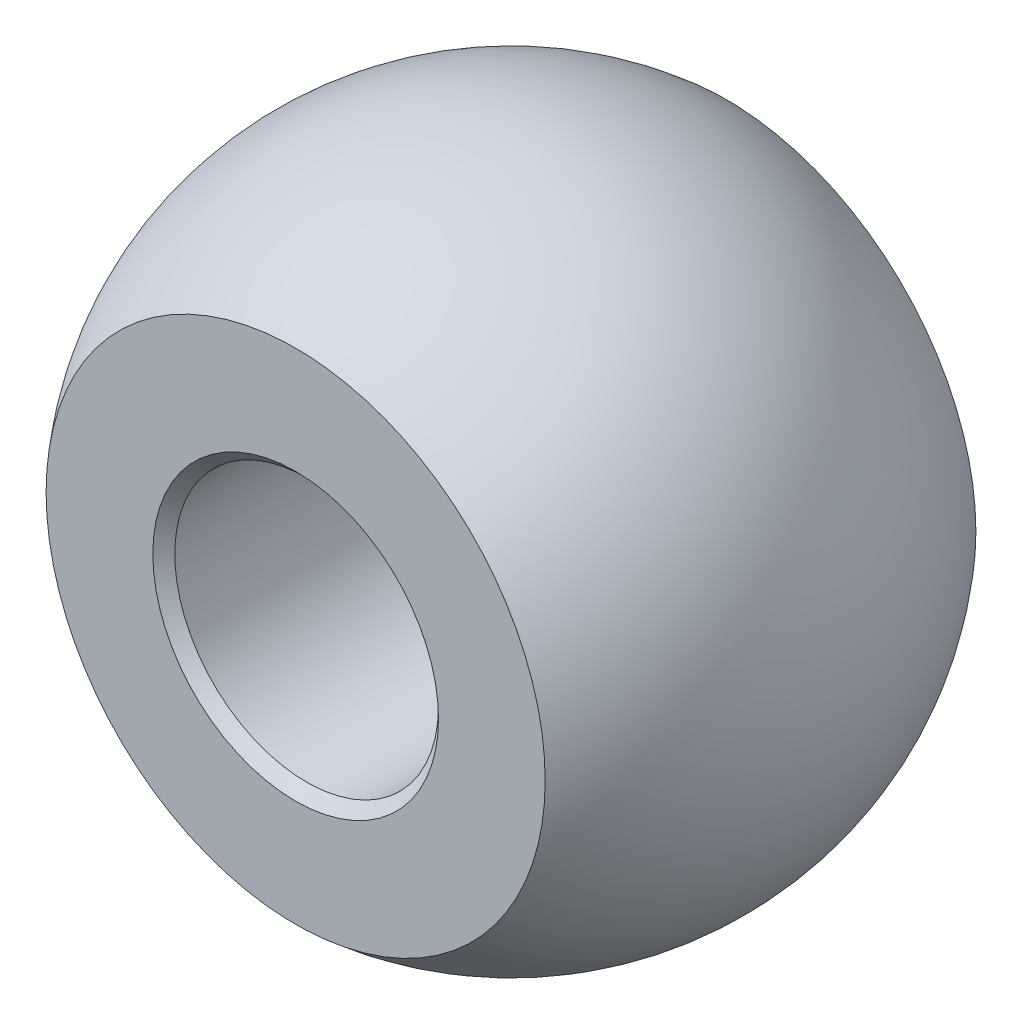
ISO-10303-21;
HEADER;
FILE_DESCRIPTION(('STEP AP214'),'2;1');
FILE_NAME('part.step','',(''),(''),'','','');
FILE_SCHEMA(('AUTOMOTIVE_DESIGN { 1 0 10303 214 1 1 1 1 }'));
ENDSEC;
DATA;
#1=APPLICATION_CONTEXT('core data for automotive mechanical design processes');
#2=APPLICATION_PROTOCOL_DEFINITION('international standard','automotive_design',2000,#1);
#3=PRODUCT_CONTEXT('',#1,'mechanical');
#4=PRODUCT('Part','Part','',(#3));
#5=PRODUCT_RELATED_PRODUCT_CATEGORY('part','',(#4));
#6=PRODUCT_DEFINITION_FORMATION('','',#4);
#7=PRODUCT_DEFINITION_CONTEXT('part definition',#1,'design');
#8=PRODUCT_DEFINITION('design','',#6,#7);
#9=PRODUCT_DEFINITION_SHAPE('','',#8);
#10=(LENGTH_UNIT() NAMED_UNIT(*) SI_UNIT(.MILLI.,.METRE.));
#11=(NAMED_UNIT(*) PLANE_ANGLE_UNIT() SI_UNIT($,.RADIAN.));
#12=(NAMED_UNIT(*) SI_UNIT($,.STERADIAN.) SOLID_ANGLE_UNIT());
#13=UNCERTAINTY_MEASURE_WITH_UNIT(LENGTH_MEASURE(1.E-05),#10,'distance_accuracy_value','');
#14=(GEOMETRIC_REPRESENTATION_CONTEXT(3) GLOBAL_UNCERTAINTY_ASSIGNED_CONTEXT((#13)) GLOBAL_UNIT_ASSIGNED_CONTEXT((#10,
#11,#12)) REPRESENTATION_CONTEXT('',''));
#15=CARTESIAN_POINT('',(0.,0.,0.));
#16=DIRECTION('',(0.,0.,1.));
#17=DIRECTION('',(1.,0.,0.));
#18=AXIS2_PLACEMENT_3D('',#15,#16,#17);
#19=CARTESIAN_POINT('',(0.,0.,0.));
#20=DIRECTION('',(0.,1.,0.));
#21=DIRECTION('',(1.,0.,0.));
#22=AXIS2_PLACEMENT_3D('',#19,#20,#21);
#23=SPHERICAL_SURFACE('',#22,3.75);
#24=CARTESIAN_POINT('',(0.,0.,0.));
#25=DIRECTION('',(0.,0.,-1.));
#26=DIRECTION('',(-1.,0.,0.));
#27=AXIS2_PLACEMENT_3D('',#24,#25,#26);
#28=SPHERICAL_SURFACE('',#27,3.75);
#29=CARTESIAN_POINT('',(0.,0.,2.45));
#30=DIRECTION('',(0.,0.,-1.));
#31=DIRECTION('',(-1.,0.,0.));
#32=AXIS2_PLACEMENT_3D('',#29,#30,#31);
#33=CIRCLE('',#32,2.83901391331568);
#34=CARTESIAN_POINT('',(-2.83901391331568,0.,2.45));
#35=VERTEX_POINT('',#34);
#36=EDGE_CURVE('E62',#35,#35,#33,.T.);
#37=ORIENTED_EDGE('',*,*,#36,.T.);
#38=EDGE_LOOP('',(#37));
#39=FACE_BOUND('',#38,.T.);
#40=CARTESIAN_POINT('',(0.,0.,-2.45));
#41=DIRECTION('',(0.,0.,1.));
#42=DIRECTION('',(1.,0.,0.));
#43=AXIS2_PLACEMENT_3D('',#40,#41,#42);
#44=CIRCLE('',#43,2.83901391331568);
#45=CARTESIAN_POINT('',(2.83901391331568,0.,-2.45));
#46=VERTEX_POINT('',#45);
#47=EDGE_CURVE('E65',#46,#46,#44,.T.);
#48=ORIENTED_EDGE('',*,*,#47,.T.);
#49=EDGE_LOOP('',(#48));
#50=FACE_BOUND('',#49,.T.);
#51=ADVANCED_FACE('F41',(#39,#50),#28,.T.);
#52=CARTESIAN_POINT('',(-3.75,3.8,-2.45));
#53=DIRECTION('',(0.,0.,1.));
#54=DIRECTION('',(1.,0.,0.));
#55=AXIS2_PLACEMENT_3D('',#52,#53,#54);
#56=PLANE('',#55);
#57=CARTESIAN_POINT('',(0.,0.,-2.45));
#58=DIRECTION('',(0.,0.,1.));
#59=DIRECTION('',(1.,0.,0.));
#60=AXIS2_PLACEMENT_3D('',#57,#58,#59);
#61=CIRCLE('',#60,1.62499999999999);
#62=CARTESIAN_POINT('',(1.62499999999999,0.,-2.45));
#63=VERTEX_POINT('',#62);
#64=EDGE_CURVE('E57',#63,#63,#61,.T.);
#65=ORIENTED_EDGE('',*,*,#64,.T.);
#66=EDGE_LOOP('',(#65));
#67=FACE_BOUND('',#66,.T.);
#68=ORIENTED_EDGE('',*,*,#47,.F.);
#69=EDGE_LOOP('',(#68));
#70=FACE_BOUND('',#69,.T.);
#71=ADVANCED_FACE('F70',(#67,#70),#56,.F.);
#72=CARTESIAN_POINT('',(-3.75,3.8,2.45));
#73=DIRECTION('',(0.,0.,-1.));
#74=DIRECTION('',(-1.,0.,0.));
#75=AXIS2_PLACEMENT_3D('',#72,#73,#74);
#76=PLANE('',#75);
#77=CARTESIAN_POINT('',(0.,0.,2.45));
#78=DIRECTION('',(0.,0.,-1.));
#79=DIRECTION('',(-1.,0.,0.));
#80=AXIS2_PLACEMENT_3D('',#77,#78,#79);
#81=CIRCLE('',#80,1.62500000000001);
#82=CARTESIAN_POINT('',(-1.62500000000001,0.,2.45));
#83=VERTEX_POINT('',#82);
#84=EDGE_CURVE('E10',#83,#83,#81,.T.);
#85=ORIENTED_EDGE('',*,*,#84,.T.);
#86=EDGE_LOOP('',(#85));
#87=FACE_BOUND('',#86,.T.);
#88=ORIENTED_EDGE('',*,*,#36,.F.);
#89=EDGE_LOOP('',(#88));
#90=FACE_BOUND('',#89,.T.);
#91=ADVANCED_FACE('F72',(#87,#90),#76,.F.);
#92=CARTESIAN_POINT('',(0.,0.,-2.45));
#93=DIRECTION('',(0.,0.,1.));
#94=DIRECTION('',(1.,0.,0.));
#95=AXIS2_PLACEMENT_3D('',#92,#93,#94);
#96=CYLINDRICAL_SURFACE('',#95,1.5);
#97=CARTESIAN_POINT('',(0.,0.,-2.32500000000001));
#98=DIRECTION('',(0.,0.,1.));
#99=DIRECTION('',(1.,0.,0.));
#100=AXIS2_PLACEMENT_3D('',#97,#98,#99);
#101=CIRCLE('',#100,1.5);
#102=CARTESIAN_POINT('',(1.5,0.,-2.32500000000001));
#103=VERTEX_POINT('',#102);
#104=EDGE_CURVE('E49',#103,#103,#101,.F.);
#105=CARTESIAN_POINT('',(0.,0.,2.325));
#106=DIRECTION('',(0.,0.,-1.));
#107=DIRECTION('',(-1.,0.,0.));
#108=AXIS2_PLACEMENT_3D('',#105,#106,#107);
#109=CIRCLE('',#108,1.5);
#110=CARTESIAN_POINT('',(1.5,0.,2.325));
#111=VERTEX_POINT('',#110);
#112=EDGE_CURVE('E53',#111,#111,#109,.F.);
#113=CARTESIAN_POINT('',(1.5,0.,-2.32500000000001));
#114=CARTESIAN_POINT('',(1.5,0.,-2.27656250000001));
#115=CARTESIAN_POINT('',(1.5,0.,-2.22812500000001));
#116=CARTESIAN_POINT('',(1.5,0.,-2.13125000000001));
#117=CARTESIAN_POINT('',(1.5,0.,-2.08281250000001));
#118=CARTESIAN_POINT('',(1.5,0.,-1.98593750000001));
#119=CARTESIAN_POINT('',(1.5,0.,-1.93750000000001));
#120=CARTESIAN_POINT('',(1.5,0.,-1.84062500000001));
#121=CARTESIAN_POINT('',(1.5,0.,-1.79218750000001));
#122=CARTESIAN_POINT('',(1.5,0.,-1.69531250000001));
#123=CARTESIAN_POINT('',(1.5,0.,-1.64687500000001));
#124=CARTESIAN_POINT('',(1.5,0.,-1.55000000000001));
#125=CARTESIAN_POINT('',(1.5,0.,-1.50156250000001));
#126=CARTESIAN_POINT('',(1.5,0.,-1.40468750000001));
#127=CARTESIAN_POINT('',(1.5,0.,-1.35625000000001));
#128=CARTESIAN_POINT('',(1.5,0.,-1.25937500000001));
#129=CARTESIAN_POINT('',(1.5,0.,-1.21093750000001));
#130=CARTESIAN_POINT('',(1.5,0.,-1.11406250000001));
#131=CARTESIAN_POINT('',(1.5,0.,-1.06562500000001));
#132=CARTESIAN_POINT('',(1.5,0.,-0.968750000000005));
#133=CARTESIAN_POINT('',(1.5,0.,-0.920312500000005));
#134=CARTESIAN_POINT('',(1.5,0.,-0.823437500000005));
#135=CARTESIAN_POINT('',(1.5,0.,-0.775000000000005));
#136=CARTESIAN_POINT('',(1.5,0.,-0.678125000000005));
#137=CARTESIAN_POINT('',(1.5,0.,-0.629687500000005));
#138=CARTESIAN_POINT('',(1.5,0.,-0.532812500000005));
#139=CARTESIAN_POINT('',(1.5,0.,-0.484375000000005));
#140=CARTESIAN_POINT('',(1.5,0.,-0.387500000000005));
#141=CARTESIAN_POINT('',(1.5,0.,-0.339062500000005));
#142=CARTESIAN_POINT('',(1.5,0.,-0.242187500000004));
#143=CARTESIAN_POINT('',(1.5,0.,-0.193750000000004));
#144=CARTESIAN_POINT('',(1.5,0.,-0.0968750000000044));
#145=CARTESIAN_POINT('',(1.5,0.,-0.0484375000000044));
#146=CARTESIAN_POINT('',(1.5,0.,0.0484374999999957));
#147=CARTESIAN_POINT('',(1.5,0.,0.0968749999999957));
#148=CARTESIAN_POINT('',(1.5,0.,0.193749999999996));
#149=CARTESIAN_POINT('',(1.5,0.,0.242187499999996));
#150=CARTESIAN_POINT('',(1.5,0.,0.339062499999996));
#151=CARTESIAN_POINT('',(1.5,0.,0.387499999999996));
#152=CARTESIAN_POINT('',(1.5,0.,0.484374999999996));
#153=CARTESIAN_POINT('',(1.5,0.,0.532812499999996));
#154=CARTESIAN_POINT('',(1.5,0.,0.629687499999996));
#155=CARTESIAN_POINT('',(1.5,0.,0.678124999999996));
#156=CARTESIAN_POINT('',(1.5,0.,0.774999999999996));
#157=CARTESIAN_POINT('',(1.5,0.,0.823437499999996));
#158=CARTESIAN_POINT('',(1.5,0.,0.920312499999996));
#159=CARTESIAN_POINT('',(1.5,0.,0.968749999999996));
#160=CARTESIAN_POINT('',(1.5,0.,1.065625));
#161=CARTESIAN_POINT('',(1.5,0.,1.1140625));
#162=CARTESIAN_POINT('',(1.5,0.,1.2109375));
#163=CARTESIAN_POINT('',(1.5,0.,1.259375));
#164=CARTESIAN_POINT('',(1.5,0.,1.35625));
#165=CARTESIAN_POINT('',(1.5,0.,1.4046875));
#166=CARTESIAN_POINT('',(1.5,0.,1.5015625));
#167=CARTESIAN_POINT('',(1.5,0.,1.55));
#168=CARTESIAN_POINT('',(1.5,0.,1.646875));
#169=CARTESIAN_POINT('',(1.5,0.,1.6953125));
#170=CARTESIAN_POINT('',(1.5,0.,1.7921875));
#171=CARTESIAN_POINT('',(1.5,0.,1.840625));
#172=CARTESIAN_POINT('',(1.5,0.,1.9375));
#173=CARTESIAN_POINT('',(1.5,0.,1.9859375));
#174=CARTESIAN_POINT('',(1.5,0.,2.0828125));
#175=CARTESIAN_POINT('',(1.5,0.,2.13125));
#176=CARTESIAN_POINT('',(1.5,0.,2.228125));
#177=CARTESIAN_POINT('',(1.5,0.,2.2765625));
#178=CARTESIAN_POINT('',(1.5,0.,2.325));
#179=B_SPLINE_CURVE_WITH_KNOTS('',3,(#113,#114,#115,#116,#117,#118,#119,#120,#121,#122,#123,
#124,#125,#126,#127,#128,#129,#130,#131,#132,#133,#134,#135,#136,#137,#138,#139,#140,#141,#142,
#143,#144,#145,#146,#147,#148,#149,#150,#151,#152,#153,#154,#155,#156,#157,#158,#159,#160,#161,
#162,#163,#164,#165,#166,#167,#168,#169,#170,#171,#172,#173,#174,#175,#176,#177,#178),
.UNSPECIFIED.,.F.,.F.,(4,2,2,2,2,2,2,2,2,2,2,2,2,2,2,2,2,2,2,2,2,2,2,2,2,2,2,2,2,2,2,2,4),(0.,
0.1453125,0.290625,0.4359375,0.58125,0.7265625,0.871875,1.0171875,1.1625,1.3078125,1.453125,
1.5984375,1.74375,1.8890625,2.034375,2.1796875,2.325,2.4703125,2.615625,2.7609375,2.90625,
3.0515625,3.196875,3.3421875,3.4875,3.6328125,3.778125,3.9234375,4.06875,4.2140625,4.359375,
4.5046875,4.65),.UNSPECIFIED.);
#180=EDGE_CURVE('BSEAM79',#103,#111,#179,.T.);
#181=ORIENTED_EDGE('',*,*,#104,.T.);
#182=ORIENTED_EDGE('',*,*,#112,.T.);
#183=ORIENTED_EDGE('',*,*,#180,.T.);
#184=ORIENTED_EDGE('',*,*,#180,.F.);
#185=EDGE_LOOP('',(#181,#183,#182,#184));
#186=FACE_BOUND('',#185,.T.);
#187=ADVANCED_FACE('F79',(#186),#96,.F.);
#188=CARTESIAN_POINT('',(0.,0.,-2.45));
#189=DIRECTION('',(0.,0.,-1.));
#190=DIRECTION('',(-1.,0.,0.));
#191=AXIS2_PLACEMENT_3D('',#188,#189,#190);
#192=CONICAL_SURFACE('',#191,1.62499999999999,0.785398163397448);
#193=ORIENTED_EDGE('',*,*,#104,.F.);
#194=EDGE_LOOP('',(#193));
#195=FACE_BOUND('',#194,.T.);
#196=ORIENTED_EDGE('',*,*,#64,.F.);
#197=EDGE_LOOP('',(#196));
#198=FACE_BOUND('',#197,.T.);
#199=ADVANCED_FACE('F85',(#195,#198),#192,.F.);
#200=CARTESIAN_POINT('',(0.,0.,2.325));
#201=DIRECTION('',(0.,0.,1.));
#202=DIRECTION('',(1.,0.,0.));
#203=AXIS2_PLACEMENT_3D('',#200,#201,#202);
#204=CONICAL_SURFACE('',#203,1.5,0.785398163397455);
#205=ORIENTED_EDGE('',*,*,#84,.F.);
#206=EDGE_LOOP('',(#205));
#207=FACE_BOUND('',#206,.T.);
#208=ORIENTED_EDGE('',*,*,#112,.F.);
#209=EDGE_LOOP('',(#208));
#210=FACE_BOUND('',#209,.T.);
#211=ADVANCED_FACE('F44',(#207,#210),#204,.F.);
#212=CLOSED_SHELL('',(#51,#71,#91,#187,#199,#211));
#213=MANIFOLD_SOLID_BREP('B2',#212);
#214=ADVANCED_BREP_SHAPE_REPRESENTATION('',(#18,#213),#14);
#215=SHAPE_DEFINITION_REPRESENTATION(#9,#214);
ENDSEC;
END-ISO-10303-21;
